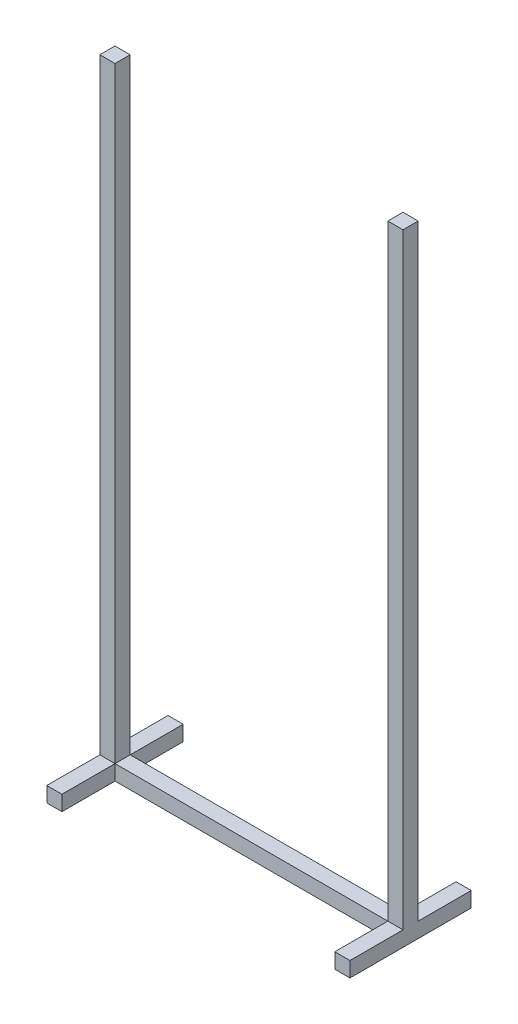
ISO-10303-21;
HEADER;
FILE_DESCRIPTION(('STEP AP214'),'2;1');
FILE_NAME('part.step','',(''),(''),'','','');
FILE_SCHEMA(('AUTOMOTIVE_DESIGN { 1 0 10303 214 1 1 1 1 }'));
ENDSEC;
DATA;
#1=APPLICATION_CONTEXT('core data for automotive mechanical design processes');
#2=APPLICATION_PROTOCOL_DEFINITION('international standard','automotive_design',2000,#1);
#3=PRODUCT_CONTEXT('',#1,'mechanical');
#4=PRODUCT('Part','Part','',(#3));
#5=PRODUCT_RELATED_PRODUCT_CATEGORY('part','',(#4));
#6=PRODUCT_DEFINITION_FORMATION('','',#4);
#7=PRODUCT_DEFINITION_CONTEXT('part definition',#1,'design');
#8=PRODUCT_DEFINITION('design','',#6,#7);
#9=PRODUCT_DEFINITION_SHAPE('','',#8);
#10=(LENGTH_UNIT() NAMED_UNIT(*) SI_UNIT(.MILLI.,.METRE.));
#11=(NAMED_UNIT(*) PLANE_ANGLE_UNIT() SI_UNIT($,.RADIAN.));
#12=(NAMED_UNIT(*) SI_UNIT($,.STERADIAN.) SOLID_ANGLE_UNIT());
#13=UNCERTAINTY_MEASURE_WITH_UNIT(LENGTH_MEASURE(1.E-05),#10,'distance_accuracy_value','');
#14=(GEOMETRIC_REPRESENTATION_CONTEXT(3) GLOBAL_UNCERTAINTY_ASSIGNED_CONTEXT((#13)) GLOBAL_UNIT_ASSIGNED_CONTEXT((#10,
#11,#12)) REPRESENTATION_CONTEXT('',''));
#15=CARTESIAN_POINT('',(0.,0.,0.));
#16=DIRECTION('',(0.,0.,1.));
#17=DIRECTION('',(1.,0.,0.));
#18=AXIS2_PLACEMENT_3D('',#15,#16,#17);
#19=CARTESIAN_POINT('',(0.,10.,0.));
#20=DIRECTION('',(0.,1.,0.));
#21=DIRECTION('',(0.,0.,1.));
#22=AXIS2_PLACEMENT_3D('',#19,#20,#21);
#23=PLANE('',#22);
#24=DIRECTION('',(0.,0.,-1.));
#25=VECTOR('',#24,1.);
#26=CARTESIAN_POINT('',(100.,10.,0.));
#27=LINE('',#26,#25);
#28=CARTESIAN_POINT('',(100.,10.,40.));
#29=VERTEX_POINT('',#28);
#30=CARTESIAN_POINT('',(100.,10.,5.));
#31=VERTEX_POINT('',#30);
#32=EDGE_CURVE('E52',#29,#31,#27,.T.);
#33=ORIENTED_EDGE('',*,*,#32,.T.);
#34=DIRECTION('',(1.,0.,0.));
#35=VECTOR('',#34,1.);
#36=CARTESIAN_POINT('',(100.,10.,5.));
#37=LINE('',#36,#35);
#38=CARTESIAN_POINT('',(90.,10.,5.));
#39=VERTEX_POINT('',#38);
#40=EDGE_CURVE('E567',#39,#31,#37,.T.);
#41=ORIENTED_EDGE('',*,*,#40,.F.);
#42=DIRECTION('',(0.,0.,-1.));
#43=VECTOR('',#42,1.);
#44=CARTESIAN_POINT('',(90.,10.,0.));
#45=LINE('',#44,#43);
#46=CARTESIAN_POINT('',(90.,10.,40.));
#47=VERTEX_POINT('',#46);
#48=EDGE_CURVE('E232',#47,#39,#45,.T.);
#49=ORIENTED_EDGE('',*,*,#48,.F.);
#50=DIRECTION('',(1.,0.,0.));
#51=VECTOR('',#50,1.);
#52=CARTESIAN_POINT('',(0.,10.,40.));
#53=LINE('',#52,#51);
#54=EDGE_CURVE('E235',#47,#29,#53,.T.);
#55=ORIENTED_EDGE('',*,*,#54,.T.);
#56=EDGE_LOOP('',(#33,#41,#49,#55));
#57=FACE_BOUND('',#56,.T.);
#58=ADVANCED_FACE('F37',(#57),#23,.T.);
#59=DIRECTION('',(1.,0.,0.));
#60=VECTOR('',#59,1.);
#61=CARTESIAN_POINT('',(0.,10.,5.));
#62=LINE('',#61,#60);
#63=CARTESIAN_POINT('',(-90.,10.,5.));
#64=VERTEX_POINT('',#63);
#65=EDGE_CURVE('E229',#64,#39,#62,.T.);
#66=ORIENTED_EDGE('',*,*,#65,.T.);
#67=DIRECTION('',(0.,0.,1.));
#68=VECTOR('',#67,1.);
#69=CARTESIAN_POINT('',(90.,10.,5.));
#70=LINE('',#69,#68);
#71=CARTESIAN_POINT('',(90.,10.,-5.));
#72=VERTEX_POINT('',#71);
#73=EDGE_CURVE('E186',#72,#39,#70,.T.);
#74=ORIENTED_EDGE('',*,*,#73,.F.);
#75=DIRECTION('',(1.,0.,0.));
#76=VECTOR('',#75,1.);
#77=CARTESIAN_POINT('',(0.,10.,-5.));
#78=LINE('',#77,#76);
#79=CARTESIAN_POINT('',(-90.,10.,-5.));
#80=VERTEX_POINT('',#79);
#81=EDGE_CURVE('E245',#80,#72,#78,.T.);
#82=ORIENTED_EDGE('',*,*,#81,.F.);
#83=DIRECTION('',(0.,0.,-1.));
#84=VECTOR('',#83,1.);
#85=CARTESIAN_POINT('',(-90.,10.,5.));
#86=LINE('',#85,#84);
#87=EDGE_CURVE('E187',#64,#80,#86,.T.);
#88=ORIENTED_EDGE('',*,*,#87,.F.);
#89=EDGE_LOOP('',(#66,#74,#82,#88));
#90=FACE_BOUND('',#89,.T.);
#91=ADVANCED_FACE('F385',(#90),#23,.T.);
#92=DIRECTION('',(0.,0.,-1.));
#93=VECTOR('',#92,1.);
#94=CARTESIAN_POINT('',(90.,10.,0.));
#95=LINE('',#94,#93);
#96=CARTESIAN_POINT('',(90.,10.,-40.));
#97=VERTEX_POINT('',#96);
#98=EDGE_CURVE('E242',#72,#97,#95,.T.);
#99=ORIENTED_EDGE('',*,*,#98,.F.);
#100=DIRECTION('',(-1.,0.,0.));
#101=VECTOR('',#100,1.);
#102=CARTESIAN_POINT('',(99.9999999999999,10.,-5.));
#103=LINE('',#102,#101);
#104=CARTESIAN_POINT('',(99.9999999999999,10.,-5.));
#105=VERTEX_POINT('',#104);
#106=EDGE_CURVE('E183',#105,#72,#103,.T.);
#107=ORIENTED_EDGE('',*,*,#106,.F.);
#108=CARTESIAN_POINT('',(100.,10.,-40.));
#109=VERTEX_POINT('',#108);
#110=EDGE_CURVE('E237',#105,#109,#27,.T.);
#111=ORIENTED_EDGE('',*,*,#110,.T.);
#112=DIRECTION('',(1.,0.,0.));
#113=VECTOR('',#112,1.);
#114=CARTESIAN_POINT('',(0.,10.,-40.));
#115=LINE('',#114,#113);
#116=EDGE_CURVE('E239',#97,#109,#115,.T.);
#117=ORIENTED_EDGE('',*,*,#116,.F.);
#118=EDGE_LOOP('',(#99,#107,#111,#117));
#119=FACE_BOUND('',#118,.T.);
#120=ADVANCED_FACE('F378',(#119),#23,.T.);
#121=DIRECTION('',(1.,0.,0.));
#122=VECTOR('',#121,1.);
#123=CARTESIAN_POINT('',(-100.,10.,5.));
#124=LINE('',#123,#122);
#125=CARTESIAN_POINT('',(-100.,10.,5.));
#126=VERTEX_POINT('',#125);
#127=EDGE_CURVE('E60',#126,#64,#124,.T.);
#128=ORIENTED_EDGE('',*,*,#127,.F.);
#129=DIRECTION('',(0.,0.,-1.));
#130=VECTOR('',#129,1.);
#131=CARTESIAN_POINT('',(-100.,10.,0.));
#132=LINE('',#131,#130);
#133=CARTESIAN_POINT('',(-100.,10.,40.0000000000001));
#134=VERTEX_POINT('',#133);
#135=EDGE_CURVE('E221',#134,#126,#132,.T.);
#136=ORIENTED_EDGE('',*,*,#135,.F.);
#137=DIRECTION('',(-1.,0.,0.));
#138=VECTOR('',#137,1.);
#139=CARTESIAN_POINT('',(0.,10.,40.0000000000001));
#140=LINE('',#139,#138);
#141=CARTESIAN_POINT('',(-90.,10.,40.0000000000001));
#142=VERTEX_POINT('',#141);
#143=EDGE_CURVE('E223',#142,#134,#140,.T.);
#144=ORIENTED_EDGE('',*,*,#143,.F.);
#145=DIRECTION('',(0.,0.,-1.));
#146=VECTOR('',#145,1.);
#147=CARTESIAN_POINT('',(-90.,10.,0.));
#148=LINE('',#147,#146);
#149=EDGE_CURVE('E227',#142,#64,#148,.T.);
#150=ORIENTED_EDGE('',*,*,#149,.T.);
#151=EDGE_LOOP('',(#128,#136,#144,#150));
#152=FACE_BOUND('',#151,.T.);
#153=ADVANCED_FACE('F376',(#152),#23,.T.);
#154=CARTESIAN_POINT('',(-100.,10.,0.));
#155=DIRECTION('',(-1.,0.,0.));
#156=DIRECTION('',(0.,0.,1.));
#157=AXIS2_PLACEMENT_3D('',#154,#155,#156);
#158=PLANE('',#157);
#159=DIRECTION('',(0.,0.,-1.));
#160=VECTOR('',#159,1.);
#161=CARTESIAN_POINT('',(-100.,0.,0.));
#162=LINE('',#161,#160);
#163=CARTESIAN_POINT('',(-100.,0.,40.0000000000001));
#164=VERTEX_POINT('',#163);
#165=CARTESIAN_POINT('',(-100.,0.,-39.9999999999999));
#166=VERTEX_POINT('',#165);
#167=EDGE_CURVE('E220',#164,#166,#162,.T.);
#168=ORIENTED_EDGE('',*,*,#167,.F.);
#169=DIRECTION('',(0.,-1.,0.));
#170=VECTOR('',#169,1.);
#171=CARTESIAN_POINT('',(-100.,10.,40.0000000000001));
#172=LINE('',#171,#170);
#173=EDGE_CURVE('E11',#134,#164,#172,.T.);
#174=ORIENTED_EDGE('',*,*,#173,.F.);
#175=ORIENTED_EDGE('',*,*,#135,.T.);
#176=DIRECTION('',(0.,-1.,0.));
#177=VECTOR('',#176,1.);
#178=CARTESIAN_POINT('',(-100.,410.,5.));
#179=LINE('',#178,#177);
#180=CARTESIAN_POINT('',(-100.,410.,5.));
#181=VERTEX_POINT('',#180);
#182=EDGE_CURVE('E211',#181,#126,#179,.T.);
#183=ORIENTED_EDGE('',*,*,#182,.F.);
#184=DIRECTION('',(0.,0.,1.));
#185=VECTOR('',#184,1.);
#186=CARTESIAN_POINT('',(-100.,410.,5.));
#187=LINE('',#186,#185);
#188=CARTESIAN_POINT('',(-100.,410.,-5.));
#189=VERTEX_POINT('',#188);
#190=EDGE_CURVE('E201',#189,#181,#187,.T.);
#191=ORIENTED_EDGE('',*,*,#190,.F.);
#192=DIRECTION('',(0.,-1.,0.));
#193=VECTOR('',#192,1.);
#194=CARTESIAN_POINT('',(-100.,410.,-5.));
#195=LINE('',#194,#193);
#196=CARTESIAN_POINT('',(-100.,10.,-5.));
#197=VERTEX_POINT('',#196);
#198=EDGE_CURVE('E214',#189,#197,#195,.T.);
#199=ORIENTED_EDGE('',*,*,#198,.T.);
#200=CARTESIAN_POINT('',(-100.,10.,-39.9999999999999));
#201=VERTEX_POINT('',#200);
#202=EDGE_CURVE('E224',#197,#201,#132,.T.);
#203=ORIENTED_EDGE('',*,*,#202,.T.);
#204=DIRECTION('',(0.,-1.,0.));
#205=VECTOR('',#204,1.);
#206=CARTESIAN_POINT('',(-100.,10.,-39.9999999999999));
#207=LINE('',#206,#205);
#208=EDGE_CURVE('E253',#201,#166,#207,.T.);
#209=ORIENTED_EDGE('',*,*,#208,.T.);
#210=EDGE_LOOP('',(#168,#174,#175,#183,#191,#199,#203,#209));
#211=FACE_BOUND('',#210,.T.);
#212=ADVANCED_FACE('F39',(#211),#158,.T.);
#213=CARTESIAN_POINT('',(0.,10.,40.0000000000001));
#214=DIRECTION('',(0.,0.,1.));
#215=DIRECTION('',(1.,0.,0.));
#216=AXIS2_PLACEMENT_3D('',#213,#214,#215);
#217=PLANE('',#216);
#218=DIRECTION('',(-1.,0.,0.));
#219=VECTOR('',#218,1.);
#220=CARTESIAN_POINT('',(0.,0.,40.0000000000001));
#221=LINE('',#220,#219);
#222=CARTESIAN_POINT('',(-90.,0.,40.0000000000001));
#223=VERTEX_POINT('',#222);
#224=EDGE_CURVE('E256',#223,#164,#221,.T.);
#225=ORIENTED_EDGE('',*,*,#224,.F.);
#226=DIRECTION('',(0.,-1.,0.));
#227=VECTOR('',#226,1.);
#228=CARTESIAN_POINT('',(-90.,10.,40.0000000000001));
#229=LINE('',#228,#227);
#230=EDGE_CURVE('E45',#142,#223,#229,.T.);
#231=ORIENTED_EDGE('',*,*,#230,.F.);
#232=ORIENTED_EDGE('',*,*,#143,.T.);
#233=ORIENTED_EDGE('',*,*,#173,.T.);
#234=EDGE_LOOP('',(#225,#231,#232,#233));
#235=FACE_BOUND('',#234,.T.);
#236=ADVANCED_FACE('F318',(#235),#217,.T.);
#237=CARTESIAN_POINT('',(-90.,10.,0.));
#238=DIRECTION('',(-1.,0.,0.));
#239=DIRECTION('',(0.,0.,1.));
#240=AXIS2_PLACEMENT_3D('',#237,#238,#239);
#241=PLANE('',#240);
#242=DIRECTION('',(0.,0.,-1.));
#243=VECTOR('',#242,1.);
#244=CARTESIAN_POINT('',(-90.,0.,0.));
#245=LINE('',#244,#243);
#246=CARTESIAN_POINT('',(-90.,0.,5.));
#247=VERTEX_POINT('',#246);
#248=EDGE_CURVE('E259',#223,#247,#245,.T.);
#249=ORIENTED_EDGE('',*,*,#248,.T.);
#250=DIRECTION('',(0.,-1.,0.));
#251=VECTOR('',#250,1.);
#252=CARTESIAN_POINT('',(-90.,10.,5.));
#253=LINE('',#252,#251);
#254=EDGE_CURVE('E305',#64,#247,#253,.T.);
#255=ORIENTED_EDGE('',*,*,#254,.F.);
#256=ORIENTED_EDGE('',*,*,#149,.F.);
#257=ORIENTED_EDGE('',*,*,#230,.T.);
#258=EDGE_LOOP('',(#249,#255,#256,#257));
#259=FACE_BOUND('',#258,.T.);
#260=ADVANCED_FACE('F310',(#259),#241,.F.);
#261=CARTESIAN_POINT('',(0.,10.,5.));
#262=DIRECTION('',(0.,0.,-1.));
#263=DIRECTION('',(-1.,0.,0.));
#264=AXIS2_PLACEMENT_3D('',#261,#262,#263);
#265=PLANE('',#264);
#266=DIRECTION('',(1.,0.,0.));
#267=VECTOR('',#266,1.);
#268=CARTESIAN_POINT('',(0.,0.,5.));
#269=LINE('',#268,#267);
#270=CARTESIAN_POINT('',(90.,0.,5.));
#271=VERTEX_POINT('',#270);
#272=EDGE_CURVE('E261',#247,#271,#269,.T.);
#273=ORIENTED_EDGE('',*,*,#272,.T.);
#274=DIRECTION('',(0.,-1.,0.));
#275=VECTOR('',#274,1.);
#276=CARTESIAN_POINT('',(90.,10.,5.));
#277=LINE('',#276,#275);
#278=EDGE_CURVE('E303',#39,#271,#277,.T.);
#279=ORIENTED_EDGE('',*,*,#278,.F.);
#280=ORIENTED_EDGE('',*,*,#65,.F.);
#281=ORIENTED_EDGE('',*,*,#254,.T.);
#282=EDGE_LOOP('',(#273,#279,#280,#281));
#283=FACE_BOUND('',#282,.T.);
#284=ADVANCED_FACE('F361',(#283),#265,.F.);
#285=CARTESIAN_POINT('',(90.,10.,0.));
#286=DIRECTION('',(-1.,0.,0.));
#287=DIRECTION('',(0.,0.,1.));
#288=AXIS2_PLACEMENT_3D('',#285,#286,#287);
#289=PLANE('',#288);
#290=DIRECTION('',(0.,0.,-1.));
#291=VECTOR('',#290,1.);
#292=CARTESIAN_POINT('',(90.,0.,0.));
#293=LINE('',#292,#291);
#294=CARTESIAN_POINT('',(90.,0.,40.));
#295=VERTEX_POINT('',#294);
#296=EDGE_CURVE('E264',#295,#271,#293,.T.);
#297=ORIENTED_EDGE('',*,*,#296,.F.);
#298=DIRECTION('',(0.,-1.,0.));
#299=VECTOR('',#298,1.);
#300=CARTESIAN_POINT('',(90.,10.,40.));
#301=LINE('',#300,#299);
#302=EDGE_CURVE('E301',#47,#295,#301,.T.);
#303=ORIENTED_EDGE('',*,*,#302,.F.);
#304=ORIENTED_EDGE('',*,*,#48,.T.);
#305=ORIENTED_EDGE('',*,*,#278,.T.);
#306=EDGE_LOOP('',(#297,#303,#304,#305));
#307=FACE_BOUND('',#306,.T.);
#308=ADVANCED_FACE('F355',(#307),#289,.T.);
#309=CARTESIAN_POINT('',(0.,10.,40.));
#310=DIRECTION('',(0.,0.,-1.));
#311=DIRECTION('',(-1.,0.,0.));
#312=AXIS2_PLACEMENT_3D('',#309,#310,#311);
#313=PLANE('',#312);
#314=DIRECTION('',(1.,0.,0.));
#315=VECTOR('',#314,1.);
#316=CARTESIAN_POINT('',(0.,0.,40.));
#317=LINE('',#316,#315);
#318=CARTESIAN_POINT('',(100.,0.,40.));
#319=VERTEX_POINT('',#318);
#320=EDGE_CURVE('E267',#295,#319,#317,.T.);
#321=ORIENTED_EDGE('',*,*,#320,.T.);
#322=DIRECTION('',(0.,-1.,0.));
#323=VECTOR('',#322,1.);
#324=CARTESIAN_POINT('',(100.,10.,40.));
#325=LINE('',#324,#323);
#326=EDGE_CURVE('E298',#29,#319,#325,.T.);
#327=ORIENTED_EDGE('',*,*,#326,.F.);
#328=ORIENTED_EDGE('',*,*,#54,.F.);
#329=ORIENTED_EDGE('',*,*,#302,.T.);
#330=EDGE_LOOP('',(#321,#327,#328,#329));
#331=FACE_BOUND('',#330,.T.);
#332=ADVANCED_FACE('F445',(#331),#313,.F.);
#333=CARTESIAN_POINT('',(100.,10.,0.));
#334=DIRECTION('',(-1.,0.,0.));
#335=DIRECTION('',(0.,0.,1.));
#336=AXIS2_PLACEMENT_3D('',#333,#334,#335);
#337=PLANE('',#336);
#338=DIRECTION('',(0.,0.,-1.));
#339=VECTOR('',#338,1.);
#340=CARTESIAN_POINT('',(100.,0.,0.));
#341=LINE('',#340,#339);
#342=CARTESIAN_POINT('',(100.,0.,-40.));
#343=VERTEX_POINT('',#342);
#344=EDGE_CURVE('E269',#319,#343,#341,.T.);
#345=ORIENTED_EDGE('',*,*,#344,.T.);
#346=DIRECTION('',(0.,-1.,0.));
#347=VECTOR('',#346,1.);
#348=CARTESIAN_POINT('',(100.,10.,-40.));
#349=LINE('',#348,#347);
#350=EDGE_CURVE('E296',#109,#343,#349,.T.);
#351=ORIENTED_EDGE('',*,*,#350,.F.);
#352=ORIENTED_EDGE('',*,*,#110,.F.);
#353=DIRECTION('',(0.,-1.,0.));
#354=VECTOR('',#353,1.);
#355=CARTESIAN_POINT('',(99.9999999999999,410.,-5.));
#356=LINE('',#355,#354);
#357=CARTESIAN_POINT('',(99.9999999999999,410.,-5.));
#358=VERTEX_POINT('',#357);
#359=EDGE_CURVE('E192',#358,#105,#356,.T.);
#360=ORIENTED_EDGE('',*,*,#359,.F.);
#361=DIRECTION('',(0.,0.,-1.));
#362=VECTOR('',#361,1.);
#363=CARTESIAN_POINT('',(100.,410.,5.));
#364=LINE('',#363,#362);
#365=CARTESIAN_POINT('',(100.,410.,5.));
#366=VERTEX_POINT('',#365);
#367=EDGE_CURVE('E173',#366,#358,#364,.T.);
#368=ORIENTED_EDGE('',*,*,#367,.F.);
#369=DIRECTION('',(0.,-1.,0.));
#370=VECTOR('',#369,1.);
#371=CARTESIAN_POINT('',(100.,410.,5.));
#372=LINE('',#371,#370);
#373=EDGE_CURVE('E170',#366,#31,#372,.T.);
#374=ORIENTED_EDGE('',*,*,#373,.T.);
#375=ORIENTED_EDGE('',*,*,#32,.F.);
#376=ORIENTED_EDGE('',*,*,#326,.T.);
#377=EDGE_LOOP('',(#345,#351,#352,#360,#368,#374,#375,#376));
#378=FACE_BOUND('',#377,.T.);
#379=ADVANCED_FACE('F349',(#378),#337,.F.);
#380=CARTESIAN_POINT('',(0.,10.,-40.));
#381=DIRECTION('',(0.,0.,-1.));
#382=DIRECTION('',(-1.,0.,0.));
#383=AXIS2_PLACEMENT_3D('',#380,#381,#382);
#384=PLANE('',#383);
#385=DIRECTION('',(1.,0.,0.));
#386=VECTOR('',#385,1.);
#387=CARTESIAN_POINT('',(0.,0.,-40.));
#388=LINE('',#387,#386);
#389=CARTESIAN_POINT('',(90.,0.,-40.));
#390=VERTEX_POINT('',#389);
#391=EDGE_CURVE('E272',#390,#343,#388,.T.);
#392=ORIENTED_EDGE('',*,*,#391,.F.);
#393=DIRECTION('',(0.,-1.,0.));
#394=VECTOR('',#393,1.);
#395=CARTESIAN_POINT('',(90.,10.,-40.));
#396=LINE('',#395,#394);
#397=EDGE_CURVE('E294',#97,#390,#396,.T.);
#398=ORIENTED_EDGE('',*,*,#397,.F.);
#399=ORIENTED_EDGE('',*,*,#116,.T.);
#400=ORIENTED_EDGE('',*,*,#350,.T.);
#401=EDGE_LOOP('',(#392,#398,#399,#400));
#402=FACE_BOUND('',#401,.T.);
#403=ADVANCED_FACE('F346',(#402),#384,.T.);
#404=CARTESIAN_POINT('',(90.,10.,0.));
#405=DIRECTION('',(-1.,0.,0.));
#406=DIRECTION('',(0.,0.,1.));
#407=AXIS2_PLACEMENT_3D('',#404,#405,#406);
#408=PLANE('',#407);
#409=DIRECTION('',(0.,0.,-1.));
#410=VECTOR('',#409,1.);
#411=CARTESIAN_POINT('',(90.,0.,0.));
#412=LINE('',#411,#410);
#413=CARTESIAN_POINT('',(90.,0.,-5.));
#414=VERTEX_POINT('',#413);
#415=EDGE_CURVE('E275',#414,#390,#412,.T.);
#416=ORIENTED_EDGE('',*,*,#415,.F.);
#417=DIRECTION('',(0.,-1.,0.));
#418=VECTOR('',#417,1.);
#419=CARTESIAN_POINT('',(90.,10.,-5.));
#420=LINE('',#419,#418);
#421=EDGE_CURVE('E292',#72,#414,#420,.T.);
#422=ORIENTED_EDGE('',*,*,#421,.F.);
#423=ORIENTED_EDGE('',*,*,#98,.T.);
#424=ORIENTED_EDGE('',*,*,#397,.T.);
#425=EDGE_LOOP('',(#416,#422,#423,#424));
#426=FACE_BOUND('',#425,.T.);
#427=ADVANCED_FACE('F342',(#426),#408,.T.);
#428=CARTESIAN_POINT('',(0.,10.,-5.));
#429=DIRECTION('',(0.,0.,-1.));
#430=DIRECTION('',(-1.,0.,0.));
#431=AXIS2_PLACEMENT_3D('',#428,#429,#430);
#432=PLANE('',#431);
#433=DIRECTION('',(1.,0.,0.));
#434=VECTOR('',#433,1.);
#435=CARTESIAN_POINT('',(0.,0.,-5.));
#436=LINE('',#435,#434);
#437=CARTESIAN_POINT('',(-90.,0.,-5.));
#438=VERTEX_POINT('',#437);
#439=EDGE_CURVE('E278',#438,#414,#436,.T.);
#440=ORIENTED_EDGE('',*,*,#439,.F.);
#441=DIRECTION('',(0.,-1.,0.));
#442=VECTOR('',#441,1.);
#443=CARTESIAN_POINT('',(-90.,10.,-5.));
#444=LINE('',#443,#442);
#445=EDGE_CURVE('E290',#80,#438,#444,.T.);
#446=ORIENTED_EDGE('',*,*,#445,.F.);
#447=ORIENTED_EDGE('',*,*,#81,.T.);
#448=ORIENTED_EDGE('',*,*,#421,.T.);
#449=EDGE_LOOP('',(#440,#446,#447,#448));
#450=FACE_BOUND('',#449,.T.);
#451=ADVANCED_FACE('F335',(#450),#432,.T.);
#452=CARTESIAN_POINT('',(-90.,10.,0.));
#453=DIRECTION('',(-1.,0.,0.));
#454=DIRECTION('',(0.,0.,1.));
#455=AXIS2_PLACEMENT_3D('',#452,#453,#454);
#456=PLANE('',#455);
#457=DIRECTION('',(0.,0.,-1.));
#458=VECTOR('',#457,1.);
#459=CARTESIAN_POINT('',(-90.,0.,0.));
#460=LINE('',#459,#458);
#461=CARTESIAN_POINT('',(-90.,0.,-39.9999999999999));
#462=VERTEX_POINT('',#461);
#463=EDGE_CURVE('E281',#438,#462,#460,.T.);
#464=ORIENTED_EDGE('',*,*,#463,.T.);
#465=DIRECTION('',(0.,-1.,0.));
#466=VECTOR('',#465,1.);
#467=CARTESIAN_POINT('',(-90.,10.,-39.9999999999999));
#468=LINE('',#467,#466);
#469=CARTESIAN_POINT('',(-90.,10.,-39.9999999999999));
#470=VERTEX_POINT('',#469);
#471=EDGE_CURVE('E287',#470,#462,#468,.T.);
#472=ORIENTED_EDGE('',*,*,#471,.F.);
#473=DIRECTION('',(0.,0.,-1.));
#474=VECTOR('',#473,1.);
#475=CARTESIAN_POINT('',(-90.,10.,0.));
#476=LINE('',#475,#474);
#477=EDGE_CURVE('E248',#80,#470,#476,.T.);
#478=ORIENTED_EDGE('',*,*,#477,.F.);
#479=ORIENTED_EDGE('',*,*,#445,.T.);
#480=EDGE_LOOP('',(#464,#472,#478,#479));
#481=FACE_BOUND('',#480,.T.);
#482=ADVANCED_FACE('F331',(#481),#456,.F.);
#483=CARTESIAN_POINT('',(0.,10.,-39.9999999999999));
#484=DIRECTION('',(0.,0.,1.));
#485=DIRECTION('',(1.,0.,0.));
#486=AXIS2_PLACEMENT_3D('',#483,#484,#485);
#487=PLANE('',#486);
#488=DIRECTION('',(-1.,0.,0.));
#489=VECTOR('',#488,1.);
#490=CARTESIAN_POINT('',(0.,0.,-39.9999999999999));
#491=LINE('',#490,#489);
#492=EDGE_CURVE('E283',#462,#166,#491,.T.);
#493=ORIENTED_EDGE('',*,*,#492,.T.);
#494=ORIENTED_EDGE('',*,*,#208,.F.);
#495=DIRECTION('',(-1.,0.,0.));
#496=VECTOR('',#495,1.);
#497=CARTESIAN_POINT('',(0.,10.,-39.9999999999999));
#498=LINE('',#497,#496);
#499=EDGE_CURVE('E250',#470,#201,#498,.T.);
#500=ORIENTED_EDGE('',*,*,#499,.F.);
#501=ORIENTED_EDGE('',*,*,#471,.T.);
#502=EDGE_LOOP('',(#493,#494,#500,#501));
#503=FACE_BOUND('',#502,.T.);
#504=ADVANCED_FACE('F326',(#503),#487,.F.);
#505=DIRECTION('',(-1.,0.,0.));
#506=VECTOR('',#505,1.);
#507=CARTESIAN_POINT('',(-100.,10.,-5.));
#508=LINE('',#507,#506);
#509=EDGE_CURVE('E190',#80,#197,#508,.T.);
#510=ORIENTED_EDGE('',*,*,#509,.F.);
#511=ORIENTED_EDGE('',*,*,#477,.T.);
#512=ORIENTED_EDGE('',*,*,#499,.T.);
#513=ORIENTED_EDGE('',*,*,#202,.F.);
#514=EDGE_LOOP('',(#510,#511,#512,#513));
#515=FACE_BOUND('',#514,.T.);
#516=ADVANCED_FACE('F380',(#515),#23,.T.);
#517=CARTESIAN_POINT('',(0.,0.,0.));
#518=DIRECTION('',(0.,1.,0.));
#519=DIRECTION('',(0.,0.,1.));
#520=AXIS2_PLACEMENT_3D('',#517,#518,#519);
#521=PLANE('',#520);
#522=ORIENTED_EDGE('',*,*,#167,.T.);
#523=ORIENTED_EDGE('',*,*,#492,.F.);
#524=ORIENTED_EDGE('',*,*,#463,.F.);
#525=ORIENTED_EDGE('',*,*,#439,.T.);
#526=ORIENTED_EDGE('',*,*,#415,.T.);
#527=ORIENTED_EDGE('',*,*,#391,.T.);
#528=ORIENTED_EDGE('',*,*,#344,.F.);
#529=ORIENTED_EDGE('',*,*,#320,.F.);
#530=ORIENTED_EDGE('',*,*,#296,.T.);
#531=ORIENTED_EDGE('',*,*,#272,.F.);
#532=ORIENTED_EDGE('',*,*,#248,.F.);
#533=ORIENTED_EDGE('',*,*,#224,.T.);
#534=EDGE_LOOP('',(#522,#523,#524,#525,#526,#527,#528,#529,#530,#531,#532,#533));
#535=FACE_BOUND('',#534,.T.);
#536=ADVANCED_FACE('F317',(#535),#521,.F.);
#537=CARTESIAN_POINT('',(-90.,410.,5.));
#538=DIRECTION('',(-1.,0.,0.));
#539=DIRECTION('',(0.,0.,1.));
#540=AXIS2_PLACEMENT_3D('',#537,#538,#539);
#541=PLANE('',#540);
#542=ORIENTED_EDGE('',*,*,#87,.T.);
#543=DIRECTION('',(0.,-1.,0.));
#544=VECTOR('',#543,1.);
#545=CARTESIAN_POINT('',(-90.,410.,-5.));
#546=LINE('',#545,#544);
#547=CARTESIAN_POINT('',(-90.,410.,-5.));
#548=VERTEX_POINT('',#547);
#549=EDGE_CURVE('E217',#548,#80,#546,.T.);
#550=ORIENTED_EDGE('',*,*,#549,.F.);
#551=DIRECTION('',(0.,0.,-1.));
#552=VECTOR('',#551,1.);
#553=CARTESIAN_POINT('',(-90.,410.,5.));
#554=LINE('',#553,#552);
#555=CARTESIAN_POINT('',(-90.,410.,5.));
#556=VERTEX_POINT('',#555);
#557=EDGE_CURVE('E196',#556,#548,#554,.T.);
#558=ORIENTED_EDGE('',*,*,#557,.F.);
#559=DIRECTION('',(0.,-1.,0.));
#560=VECTOR('',#559,1.);
#561=CARTESIAN_POINT('',(-90.,410.,5.));
#562=LINE('',#561,#560);
#563=EDGE_CURVE('E204',#556,#64,#562,.T.);
#564=ORIENTED_EDGE('',*,*,#563,.T.);
#565=EDGE_LOOP('',(#542,#550,#558,#564));
#566=FACE_BOUND('',#565,.T.);
#567=ADVANCED_FACE('F370',(#566),#541,.F.);
#568=CARTESIAN_POINT('',(-100.,410.,-5.));
#569=DIRECTION('',(0.,0.,1.));
#570=DIRECTION('',(1.,0.,0.));
#571=AXIS2_PLACEMENT_3D('',#568,#569,#570);
#572=PLANE('',#571);
#573=ORIENTED_EDGE('',*,*,#509,.T.);
#574=ORIENTED_EDGE('',*,*,#198,.F.);
#575=DIRECTION('',(-1.,0.,0.));
#576=VECTOR('',#575,1.);
#577=CARTESIAN_POINT('',(-100.,410.,-5.));
#578=LINE('',#577,#576);
#579=EDGE_CURVE('E199',#548,#189,#578,.T.);
#580=ORIENTED_EDGE('',*,*,#579,.F.);
#581=ORIENTED_EDGE('',*,*,#549,.T.);
#582=EDGE_LOOP('',(#573,#574,#580,#581));
#583=FACE_BOUND('',#582,.T.);
#584=ADVANCED_FACE('F501',(#583),#572,.F.);
#585=CARTESIAN_POINT('',(-100.,410.,5.));
#586=DIRECTION('',(0.,0.,-1.));
#587=DIRECTION('',(-1.,0.,0.));
#588=AXIS2_PLACEMENT_3D('',#585,#586,#587);
#589=PLANE('',#588);
#590=ORIENTED_EDGE('',*,*,#127,.T.);
#591=ORIENTED_EDGE('',*,*,#563,.F.);
#592=DIRECTION('',(1.,0.,0.));
#593=VECTOR('',#592,1.);
#594=CARTESIAN_POINT('',(-100.,410.,5.));
#595=LINE('',#594,#593);
#596=EDGE_CURVE('E203',#181,#556,#595,.T.);
#597=ORIENTED_EDGE('',*,*,#596,.F.);
#598=ORIENTED_EDGE('',*,*,#182,.T.);
#599=EDGE_LOOP('',(#590,#591,#597,#598));
#600=FACE_BOUND('',#599,.T.);
#601=ADVANCED_FACE('F365',(#600),#589,.F.);
#602=CARTESIAN_POINT('',(0.,410.,0.));
#603=DIRECTION('',(0.,-1.,0.));
#604=DIRECTION('',(0.,0.,-1.));
#605=AXIS2_PLACEMENT_3D('',#602,#603,#604);
#606=PLANE('',#605);
#607=ORIENTED_EDGE('',*,*,#557,.T.);
#608=ORIENTED_EDGE('',*,*,#579,.T.);
#609=ORIENTED_EDGE('',*,*,#190,.T.);
#610=ORIENTED_EDGE('',*,*,#596,.T.);
#611=EDGE_LOOP('',(#607,#608,#609,#610));
#612=FACE_BOUND('',#611,.T.);
#613=ADVANCED_FACE('F373',(#612),#606,.F.);
#614=CARTESIAN_POINT('',(90.,410.,5.));
#615=DIRECTION('',(1.,0.,0.));
#616=DIRECTION('',(0.,0.,-1.));
#617=AXIS2_PLACEMENT_3D('',#614,#615,#616);
#618=PLANE('',#617);
#619=ORIENTED_EDGE('',*,*,#73,.T.);
#620=DIRECTION('',(0.,-1.,0.));
#621=VECTOR('',#620,1.);
#622=CARTESIAN_POINT('',(90.,410.,5.));
#623=LINE('',#622,#621);
#624=CARTESIAN_POINT('',(90.,410.,5.));
#625=VERTEX_POINT('',#624);
#626=EDGE_CURVE('E167',#625,#39,#623,.T.);
#627=ORIENTED_EDGE('',*,*,#626,.F.);
#628=DIRECTION('',(0.,0.,1.));
#629=VECTOR('',#628,1.);
#630=CARTESIAN_POINT('',(90.,410.,5.));
#631=LINE('',#630,#629);
#632=CARTESIAN_POINT('',(90.,410.,-5.));
#633=VERTEX_POINT('',#632);
#634=EDGE_CURVE('E174',#633,#625,#631,.T.);
#635=ORIENTED_EDGE('',*,*,#634,.F.);
#636=DIRECTION('',(0.,-1.,0.));
#637=VECTOR('',#636,1.);
#638=CARTESIAN_POINT('',(90.,410.,-5.));
#639=LINE('',#638,#637);
#640=EDGE_CURVE('E565',#633,#72,#639,.T.);
#641=ORIENTED_EDGE('',*,*,#640,.T.);
#642=EDGE_LOOP('',(#619,#627,#635,#641));
#643=FACE_BOUND('',#642,.T.);
#644=ADVANCED_FACE('F185',(#643),#618,.F.);
#645=CARTESIAN_POINT('',(100.,410.,5.));
#646=DIRECTION('',(0.,0.,-1.));
#647=DIRECTION('',(-1.,0.,0.));
#648=AXIS2_PLACEMENT_3D('',#645,#646,#647);
#649=PLANE('',#648);
#650=ORIENTED_EDGE('',*,*,#40,.T.);
#651=ORIENTED_EDGE('',*,*,#373,.F.);
#652=DIRECTION('',(1.,0.,0.));
#653=VECTOR('',#652,1.);
#654=CARTESIAN_POINT('',(100.,410.,5.));
#655=LINE('',#654,#653);
#656=EDGE_CURVE('E163',#625,#366,#655,.T.);
#657=ORIENTED_EDGE('',*,*,#656,.F.);
#658=ORIENTED_EDGE('',*,*,#626,.T.);
#659=EDGE_LOOP('',(#650,#651,#657,#658));
#660=FACE_BOUND('',#659,.T.);
#661=ADVANCED_FACE('F165',(#660),#649,.F.);
#662=CARTESIAN_POINT('',(99.9999999999999,410.,-5.));
#663=DIRECTION('',(0.,0.,1.));
#664=DIRECTION('',(1.,0.,0.));
#665=AXIS2_PLACEMENT_3D('',#662,#663,#664);
#666=PLANE('',#665);
#667=ORIENTED_EDGE('',*,*,#106,.T.);
#668=ORIENTED_EDGE('',*,*,#640,.F.);
#669=DIRECTION('',(-1.,0.,0.));
#670=VECTOR('',#669,1.);
#671=CARTESIAN_POINT('',(99.9999999999999,410.,-5.));
#672=LINE('',#671,#670);
#673=EDGE_CURVE('E179',#358,#633,#672,.T.);
#674=ORIENTED_EDGE('',*,*,#673,.F.);
#675=ORIENTED_EDGE('',*,*,#359,.T.);
#676=EDGE_LOOP('',(#667,#668,#674,#675));
#677=FACE_BOUND('',#676,.T.);
#678=ADVANCED_FACE('F542',(#677),#666,.F.);
#679=CARTESIAN_POINT('',(0.,410.,0.));
#680=DIRECTION('',(0.,1.,0.));
#681=DIRECTION('',(0.,0.,1.));
#682=AXIS2_PLACEMENT_3D('',#679,#680,#681);
#683=PLANE('',#682);
#684=ORIENTED_EDGE('',*,*,#634,.T.);
#685=ORIENTED_EDGE('',*,*,#656,.T.);
#686=ORIENTED_EDGE('',*,*,#367,.T.);
#687=ORIENTED_EDGE('',*,*,#673,.T.);
#688=EDGE_LOOP('',(#684,#685,#686,#687));
#689=FACE_BOUND('',#688,.T.);
#690=ADVANCED_FACE('F177',(#689),#683,.T.);
#691=CLOSED_SHELL('',(#58,#91,#120,#153,#212,#236,#260,#284,#308,#332,#379,#403,#427,#451,#482,
#504,#516,#536,#567,#584,#601,#613,#644,#661,#678,#690));
#692=MANIFOLD_SOLID_BREP('B2',#691);
#693=ADVANCED_BREP_SHAPE_REPRESENTATION('',(#18,#692),#14);
#694=SHAPE_DEFINITION_REPRESENTATION(#9,#693);
ENDSEC;
END-ISO-10303-21;
